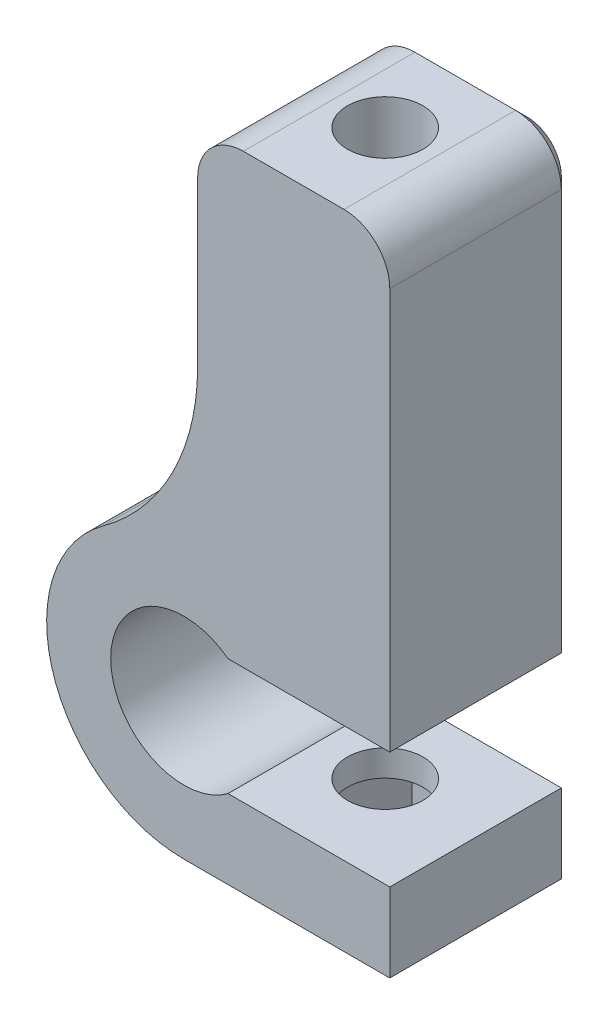
ISO-10303-21;
HEADER;
FILE_DESCRIPTION(('STEP AP214'),'2;1');
FILE_NAME('part.step','',(''),(''),'','','');
FILE_SCHEMA(('AUTOMOTIVE_DESIGN { 1 0 10303 214 1 1 1 1 }'));
ENDSEC;
DATA;
#1=APPLICATION_CONTEXT('core data for automotive mechanical design processes');
#2=APPLICATION_PROTOCOL_DEFINITION('international standard','automotive_design',2000,#1);
#3=PRODUCT_CONTEXT('',#1,'mechanical');
#4=PRODUCT('Part','Part','',(#3));
#5=PRODUCT_RELATED_PRODUCT_CATEGORY('part','',(#4));
#6=PRODUCT_DEFINITION_FORMATION('','',#4);
#7=PRODUCT_DEFINITION_CONTEXT('part definition',#1,'design');
#8=PRODUCT_DEFINITION('design','',#6,#7);
#9=PRODUCT_DEFINITION_SHAPE('','',#8);
#10=(LENGTH_UNIT() NAMED_UNIT(*) SI_UNIT(.MILLI.,.METRE.));
#11=(NAMED_UNIT(*) PLANE_ANGLE_UNIT() SI_UNIT($,.RADIAN.));
#12=(NAMED_UNIT(*) SI_UNIT($,.STERADIAN.) SOLID_ANGLE_UNIT());
#13=UNCERTAINTY_MEASURE_WITH_UNIT(LENGTH_MEASURE(1.E-05),#10,'distance_accuracy_value','');
#14=(GEOMETRIC_REPRESENTATION_CONTEXT(3) GLOBAL_UNCERTAINTY_ASSIGNED_CONTEXT((#13)) GLOBAL_UNIT_ASSIGNED_CONTEXT((#10,
#11,#12)) REPRESENTATION_CONTEXT('',''));
#15=CARTESIAN_POINT('',(0.,0.,0.));
#16=DIRECTION('',(0.,0.,1.));
#17=DIRECTION('',(1.,0.,0.));
#18=AXIS2_PLACEMENT_3D('',#15,#16,#17);
#19=CARTESIAN_POINT('',(4.8,6.,4.));
#20=DIRECTION('',(0.,-1.,0.));
#21=DIRECTION('',(0.,0.,-1.));
#22=AXIS2_PLACEMENT_3D('',#19,#20,#21);
#23=CYLINDRICAL_SURFACE('',#22,1.65);
#24=CARTESIAN_POINT('',(4.8,-2.55271057360235,4.));
#25=DIRECTION('',(0.,-1.,0.));
#26=DIRECTION('',(1.,0.,0.));
#27=AXIS2_PLACEMENT_3D('',#24,#25,#26);
#28=CIRCLE('',#27,1.65);
#29=CARTESIAN_POINT('',(6.45,-2.55271057360235,4.));
#30=VERTEX_POINT('',#29);
#31=EDGE_CURVE('E264',#30,#30,#28,.T.);
#32=ORIENTED_EDGE('',*,*,#31,.F.);
#33=EDGE_LOOP('',(#32));
#34=FACE_BOUND('',#33,.T.);
#35=CARTESIAN_POINT('',(4.8,-3.7,4.));
#36=DIRECTION('',(0.,-1.,0.));
#37=DIRECTION('',(0.,0.,-1.));
#38=AXIS2_PLACEMENT_3D('',#35,#36,#37);
#39=CIRCLE('',#38,1.65);
#40=CARTESIAN_POINT('',(4.8,-3.7,2.35));
#41=VERTEX_POINT('',#40);
#42=EDGE_CURVE('E252',#41,#41,#39,.F.);
#43=ORIENTED_EDGE('',*,*,#42,.F.);
#44=EDGE_LOOP('',(#43));
#45=FACE_BOUND('',#44,.T.);
#46=ADVANCED_FACE('F34',(#34,#45),#23,.F.);
#47=CARTESIAN_POINT('',(0.,0.,8.));
#48=DIRECTION('',(0.,0.,-1.));
#49=DIRECTION('',(-1.,0.,0.));
#50=AXIS2_PLACEMENT_3D('',#47,#48,#49);
#51=CYLINDRICAL_SURFACE('',#50,3.2);
#52=DIRECTION('',(0.,0.,-1.));
#53=VECTOR('',#52,1.);
#54=CARTESIAN_POINT('',(1.92968099110157,-2.55271057360235,8.));
#55=LINE('',#54,#53);
#56=CARTESIAN_POINT('',(1.92968099110157,-2.55271057360235,8.));
#57=VERTEX_POINT('',#56);
#58=CARTESIAN_POINT('',(1.92968099110157,-2.55271057360235,0.500000000000002));
#59=VERTEX_POINT('',#58);
#60=EDGE_CURVE('E280',#57,#59,#55,.T.);
#61=ORIENTED_EDGE('',*,*,#60,.T.);
#62=CARTESIAN_POINT('',(0.,0.,0.500000000000002));
#63=DIRECTION('',(0.,0.,1.));
#64=DIRECTION('',(1.,0.,0.));
#65=AXIS2_PLACEMENT_3D('',#62,#63,#64);
#66=CIRCLE('',#65,3.2);
#67=CARTESIAN_POINT('',(1.92968099110157,2.55271057360235,0.500000000000002));
#68=VERTEX_POINT('',#67);
#69=EDGE_CURVE('E11',#59,#68,#66,.F.);
#70=ORIENTED_EDGE('',*,*,#69,.T.);
#71=DIRECTION('',(0.,0.,-1.));
#72=VECTOR('',#71,1.);
#73=CARTESIAN_POINT('',(1.92968099110157,2.55271057360235,8.));
#74=LINE('',#73,#72);
#75=CARTESIAN_POINT('',(1.92968099110157,2.55271057360235,8.));
#76=VERTEX_POINT('',#75);
#77=EDGE_CURVE('E293',#76,#68,#74,.T.);
#78=ORIENTED_EDGE('',*,*,#77,.F.);
#79=CARTESIAN_POINT('',(0.,0.,8.));
#80=DIRECTION('',(0.,0.,-1.));
#81=DIRECTION('',(1.,0.,0.));
#82=AXIS2_PLACEMENT_3D('',#79,#80,#81);
#83=CIRCLE('',#82,3.2);
#84=EDGE_CURVE('E263',#57,#76,#83,.T.);
#85=ORIENTED_EDGE('',*,*,#84,.F.);
#86=EDGE_LOOP('',(#61,#70,#78,#85));
#87=FACE_BOUND('',#86,.T.);
#88=ADVANCED_FACE('F477',(#87),#51,.F.);
#89=CARTESIAN_POINT('',(9.,2.55271057360236,8.));
#90=DIRECTION('',(0.,1.,0.));
#91=DIRECTION('',(-1.,0.,0.));
#92=AXIS2_PLACEMENT_3D('',#89,#90,#91);
#93=PLANE('',#92);
#94=CARTESIAN_POINT('',(4.8,2.55271057360236,4.));
#95=DIRECTION('',(0.,1.,0.));
#96=DIRECTION('',(-1.,0.,0.));
#97=AXIS2_PLACEMENT_3D('',#94,#95,#96);
#98=CIRCLE('',#97,1.65);
#99=CARTESIAN_POINT('',(3.15,2.55271057360236,4.));
#100=VERTEX_POINT('',#99);
#101=EDGE_CURVE('E260',#100,#100,#98,.T.);
#102=ORIENTED_EDGE('',*,*,#101,.T.);
#103=EDGE_LOOP('',(#102));
#104=FACE_BOUND('',#103,.T.);
#105=ORIENTED_EDGE('',*,*,#77,.T.);
#106=DIRECTION('',(1.,0.,0.));
#107=VECTOR('',#106,1.);
#108=CARTESIAN_POINT('',(9.,2.55271057360236,0.500000000000002));
#109=LINE('',#108,#107);
#110=CARTESIAN_POINT('',(9.,2.55271057360236,0.500000000000002));
#111=VERTEX_POINT('',#110);
#112=EDGE_CURVE('E364',#68,#111,#109,.T.);
#113=ORIENTED_EDGE('',*,*,#112,.T.);
#114=DIRECTION('',(0.,0.,-1.));
#115=VECTOR('',#114,1.);
#116=CARTESIAN_POINT('',(9.,2.55271057360236,8.));
#117=LINE('',#116,#115);
#118=CARTESIAN_POINT('',(9.,2.55271057360236,8.));
#119=VERTEX_POINT('',#118);
#120=EDGE_CURVE('E290',#119,#111,#117,.T.);
#121=ORIENTED_EDGE('',*,*,#120,.F.);
#122=DIRECTION('',(1.,0.,0.));
#123=VECTOR('',#122,1.);
#124=CARTESIAN_POINT('',(9.,2.55271057360236,8.));
#125=LINE('',#124,#123);
#126=EDGE_CURVE('E267',#76,#119,#125,.T.);
#127=ORIENTED_EDGE('',*,*,#126,.F.);
#128=EDGE_LOOP('',(#105,#113,#121,#127));
#129=FACE_BOUND('',#128,.T.);
#130=ADVANCED_FACE('F480',(#104,#129),#93,.F.);
#131=CARTESIAN_POINT('',(9.,6.,8.));
#132=DIRECTION('',(-1.,0.,0.));
#133=DIRECTION('',(0.,0.,1.));
#134=AXIS2_PLACEMENT_3D('',#131,#132,#133);
#135=PLANE('',#134);
#136=ORIENTED_EDGE('',*,*,#120,.T.);
#137=DIRECTION('',(0.,1.,0.));
#138=VECTOR('',#137,1.);
#139=CARTESIAN_POINT('',(9.,6.,0.500000000000002));
#140=LINE('',#139,#138);
#141=CARTESIAN_POINT('',(9.,20.1,0.500000000000002));
#142=VERTEX_POINT('',#141);
#143=EDGE_CURVE('E320',#111,#142,#140,.T.);
#144=ORIENTED_EDGE('',*,*,#143,.T.);
#145=DIRECTION('',(0.,0.,-1.));
#146=VECTOR('',#145,1.);
#147=CARTESIAN_POINT('',(9.,20.1,8.));
#148=LINE('',#147,#146);
#149=CARTESIAN_POINT('',(9.,20.1,8.));
#150=VERTEX_POINT('',#149);
#151=EDGE_CURVE('E311',#142,#150,#148,.F.);
#152=ORIENTED_EDGE('',*,*,#151,.T.);
#153=DIRECTION('',(0.,1.,0.));
#154=VECTOR('',#153,1.);
#155=CARTESIAN_POINT('',(9.,6.,8.));
#156=LINE('',#155,#154);
#157=EDGE_CURVE('E269',#119,#150,#156,.T.);
#158=ORIENTED_EDGE('',*,*,#157,.F.);
#159=EDGE_LOOP('',(#136,#144,#152,#158));
#160=FACE_BOUND('',#159,.T.);
#161=ADVANCED_FACE('F495',(#160),#135,.F.);
#162=CARTESIAN_POINT('',(0.,0.,8.));
#163=DIRECTION('',(0.,0.,-1.));
#164=DIRECTION('',(-1.,0.,0.));
#165=AXIS2_PLACEMENT_3D('',#162,#163,#164);
#166=CYLINDRICAL_SURFACE('',#165,6.);
#167=DIRECTION('',(0.,0.,-1.));
#168=VECTOR('',#167,1.);
#169=CARTESIAN_POINT('',(-3.525,4.85534499289185,8.));
#170=LINE('',#169,#168);
#171=CARTESIAN_POINT('',(-3.525,4.85534499289185,8.));
#172=VERTEX_POINT('',#171);
#173=CARTESIAN_POINT('',(-3.525,4.85534499289185,0.500000000000002));
#174=VERTEX_POINT('',#173);
#175=EDGE_CURVE('E301',#172,#174,#170,.T.);
#176=ORIENTED_EDGE('',*,*,#175,.T.);
#177=CARTESIAN_POINT('',(0.,0.,0.500000000000002));
#178=DIRECTION('',(0.,0.,1.));
#179=DIRECTION('',(1.,0.,0.));
#180=AXIS2_PLACEMENT_3D('',#177,#178,#179);
#181=CIRCLE('',#180,6.);
#182=CARTESIAN_POINT('',(0.,-6.,0.500000000000002));
#183=VERTEX_POINT('',#182);
#184=EDGE_CURVE('E358',#174,#183,#181,.T.);
#185=ORIENTED_EDGE('',*,*,#184,.T.);
#186=DIRECTION('',(0.,0.,-1.));
#187=VECTOR('',#186,1.);
#188=CARTESIAN_POINT('',(0.,-6.,8.));
#189=LINE('',#188,#187);
#190=CARTESIAN_POINT('',(0.,-6.,8.));
#191=VERTEX_POINT('',#190);
#192=EDGE_CURVE('E287',#191,#183,#189,.T.);
#193=ORIENTED_EDGE('',*,*,#192,.F.);
#194=CARTESIAN_POINT('',(0.,0.,8.));
#195=DIRECTION('',(0.,0.,1.));
#196=DIRECTION('',(1.,0.,0.));
#197=AXIS2_PLACEMENT_3D('',#194,#195,#196);
#198=CIRCLE('',#197,6.);
#199=EDGE_CURVE('E272',#172,#191,#198,.T.);
#200=ORIENTED_EDGE('',*,*,#199,.F.);
#201=EDGE_LOOP('',(#176,#185,#193,#200));
#202=FACE_BOUND('',#201,.T.);
#203=ADVANCED_FACE('F458',(#202),#166,.T.);
#204=CARTESIAN_POINT('',(0.,-6.,8.));
#205=DIRECTION('',(0.,1.,0.));
#206=DIRECTION('',(0.,0.,1.));
#207=AXIS2_PLACEMENT_3D('',#204,#205,#206);
#208=PLANE('',#207);
#209=DIRECTION('',(-1.,0.,0.));
#210=VECTOR('',#209,1.);
#211=CARTESIAN_POINT('',(6.4,-6.,6.7712812921102));
#212=LINE('',#211,#210);
#213=CARTESIAN_POINT('',(6.4,-6.,6.7712812921102));
#214=VERTEX_POINT('',#213);
#215=CARTESIAN_POINT('',(3.2,-6.,6.7712812921102));
#216=VERTEX_POINT('',#215);
#217=EDGE_CURVE('E240',#214,#216,#212,.T.);
#218=ORIENTED_EDGE('',*,*,#217,.F.);
#219=DIRECTION('',(-0.5,0.,0.866025403784439));
#220=VECTOR('',#219,1.);
#221=CARTESIAN_POINT('',(8.,-6.,4.));
#222=LINE('',#221,#220);
#223=CARTESIAN_POINT('',(8.,-6.,4.));
#224=VERTEX_POINT('',#223);
#225=EDGE_CURVE('E204',#224,#214,#222,.T.);
#226=ORIENTED_EDGE('',*,*,#225,.F.);
#227=DIRECTION('',(0.5,0.,0.866025403784439));
#228=VECTOR('',#227,1.);
#229=CARTESIAN_POINT('',(6.4,-6.,1.2287187078898));
#230=LINE('',#229,#228);
#231=CARTESIAN_POINT('',(6.4,-6.,1.2287187078898));
#232=VERTEX_POINT('',#231);
#233=EDGE_CURVE('E223',#232,#224,#230,.T.);
#234=ORIENTED_EDGE('',*,*,#233,.F.);
#235=DIRECTION('',(1.,0.,0.));
#236=VECTOR('',#235,1.);
#237=CARTESIAN_POINT('',(3.2,-6.,1.2287187078898));
#238=LINE('',#237,#236);
#239=CARTESIAN_POINT('',(3.2,-6.,1.2287187078898));
#240=VERTEX_POINT('',#239);
#241=EDGE_CURVE('E226',#240,#232,#238,.T.);
#242=ORIENTED_EDGE('',*,*,#241,.F.);
#243=DIRECTION('',(0.5,0.,-0.866025403784438));
#244=VECTOR('',#243,1.);
#245=CARTESIAN_POINT('',(1.6,-6.,4.));
#246=LINE('',#245,#244);
#247=CARTESIAN_POINT('',(1.6,-6.,4.));
#248=VERTEX_POINT('',#247);
#249=EDGE_CURVE('E245',#248,#240,#246,.T.);
#250=ORIENTED_EDGE('',*,*,#249,.F.);
#251=DIRECTION('',(-0.5,0.,-0.866025403784439));
#252=VECTOR('',#251,1.);
#253=CARTESIAN_POINT('',(3.2,-6.,6.7712812921102));
#254=LINE('',#253,#252);
#255=EDGE_CURVE('E242',#216,#248,#254,.T.);
#256=ORIENTED_EDGE('',*,*,#255,.F.);
#257=EDGE_LOOP('',(#218,#226,#234,#242,#250,#256));
#258=FACE_BOUND('',#257,.T.);
#259=ORIENTED_EDGE('',*,*,#192,.T.);
#260=DIRECTION('',(1.,0.,0.));
#261=VECTOR('',#260,1.);
#262=CARTESIAN_POINT('',(0.,-6.,0.500000000000002));
#263=LINE('',#262,#261);
#264=CARTESIAN_POINT('',(9.,-6.,0.500000000000002));
#265=VERTEX_POINT('',#264);
#266=EDGE_CURVE('E360',#183,#265,#263,.T.);
#267=ORIENTED_EDGE('',*,*,#266,.T.);
#268=DIRECTION('',(0.,0.,-1.));
#269=VECTOR('',#268,1.);
#270=CARTESIAN_POINT('',(9.,-6.,8.));
#271=LINE('',#270,#269);
#272=CARTESIAN_POINT('',(9.,-6.,8.));
#273=VERTEX_POINT('',#272);
#274=EDGE_CURVE('E284',#273,#265,#271,.T.);
#275=ORIENTED_EDGE('',*,*,#274,.F.);
#276=DIRECTION('',(1.,0.,0.));
#277=VECTOR('',#276,1.);
#278=CARTESIAN_POINT('',(0.,-6.,8.));
#279=LINE('',#278,#277);
#280=EDGE_CURVE('E274',#191,#273,#279,.T.);
#281=ORIENTED_EDGE('',*,*,#280,.F.);
#282=EDGE_LOOP('',(#259,#267,#275,#281));
#283=FACE_BOUND('',#282,.T.);
#284=ADVANCED_FACE('F467',(#258,#283),#208,.F.);
#285=CARTESIAN_POINT('',(9.,-6.,8.));
#286=DIRECTION('',(-1.,0.,0.));
#287=DIRECTION('',(0.,0.,1.));
#288=AXIS2_PLACEMENT_3D('',#285,#286,#287);
#289=PLANE('',#288);
#290=ORIENTED_EDGE('',*,*,#274,.T.);
#291=DIRECTION('',(0.,1.,0.));
#292=VECTOR('',#291,1.);
#293=CARTESIAN_POINT('',(9.,-6.,0.500000000000002));
#294=LINE('',#293,#292);
#295=CARTESIAN_POINT('',(9.,-2.55271057360236,0.500000000000002));
#296=VERTEX_POINT('',#295);
#297=EDGE_CURVE('E362',#265,#296,#294,.T.);
#298=ORIENTED_EDGE('',*,*,#297,.T.);
#299=DIRECTION('',(0.,0.,-1.));
#300=VECTOR('',#299,1.);
#301=CARTESIAN_POINT('',(9.,-2.55271057360236,8.));
#302=LINE('',#301,#300);
#303=CARTESIAN_POINT('',(9.,-2.55271057360236,8.));
#304=VERTEX_POINT('',#303);
#305=EDGE_CURVE('E282',#304,#296,#302,.T.);
#306=ORIENTED_EDGE('',*,*,#305,.F.);
#307=DIRECTION('',(0.,1.,0.));
#308=VECTOR('',#307,1.);
#309=CARTESIAN_POINT('',(9.,-6.,8.));
#310=LINE('',#309,#308);
#311=EDGE_CURVE('E276',#273,#304,#310,.T.);
#312=ORIENTED_EDGE('',*,*,#311,.F.);
#313=EDGE_LOOP('',(#290,#298,#306,#312));
#314=FACE_BOUND('',#313,.T.);
#315=ADVANCED_FACE('F471',(#314),#289,.F.);
#316=CARTESIAN_POINT('',(9.,-2.55271057360236,8.));
#317=DIRECTION('',(0.,-1.,0.));
#318=DIRECTION('',(1.,0.,0.));
#319=AXIS2_PLACEMENT_3D('',#316,#317,#318);
#320=PLANE('',#319);
#321=ORIENTED_EDGE('',*,*,#31,.T.);
#322=EDGE_LOOP('',(#321));
#323=FACE_BOUND('',#322,.T.);
#324=ORIENTED_EDGE('',*,*,#305,.T.);
#325=DIRECTION('',(-1.,0.,0.));
#326=VECTOR('',#325,1.);
#327=CARTESIAN_POINT('',(9.,-2.55271057360236,0.500000000000002));
#328=LINE('',#327,#326);
#329=EDGE_CURVE('E43',#296,#59,#328,.T.);
#330=ORIENTED_EDGE('',*,*,#329,.T.);
#331=ORIENTED_EDGE('',*,*,#60,.F.);
#332=DIRECTION('',(-1.,0.,0.));
#333=VECTOR('',#332,1.);
#334=CARTESIAN_POINT('',(9.,-2.55271057360236,8.));
#335=LINE('',#334,#333);
#336=EDGE_CURVE('E278',#304,#57,#335,.T.);
#337=ORIENTED_EDGE('',*,*,#336,.F.);
#338=EDGE_LOOP('',(#324,#330,#331,#337));
#339=FACE_BOUND('',#338,.T.);
#340=ADVANCED_FACE('F475',(#323,#339),#320,.F.);
#341=CARTESIAN_POINT('',(0.,0.,8.));
#342=DIRECTION('',(0.,0.,1.));
#343=DIRECTION('',(1.,0.,0.));
#344=AXIS2_PLACEMENT_3D('',#341,#342,#343);
#345=PLANE('',#344);
#346=ORIENTED_EDGE('',*,*,#157,.T.);
#347=CARTESIAN_POINT('',(7.,20.1,8.));
#348=DIRECTION('',(0.,0.,1.));
#349=DIRECTION('',(1.,0.,0.));
#350=AXIS2_PLACEMENT_3D('',#347,#348,#349);
#351=CIRCLE('',#350,2.);
#352=CARTESIAN_POINT('',(7.,22.1,8.));
#353=VERTEX_POINT('',#352);
#354=EDGE_CURVE('E315',#150,#353,#351,.T.);
#355=ORIENTED_EDGE('',*,*,#354,.T.);
#356=DIRECTION('',(1.,0.,0.));
#357=VECTOR('',#356,1.);
#358=CARTESIAN_POINT('',(0.6,22.1,8.));
#359=LINE('',#358,#357);
#360=CARTESIAN_POINT('',(2.6,22.1,8.));
#361=VERTEX_POINT('',#360);
#362=EDGE_CURVE('E435',#361,#353,#359,.T.);
#363=ORIENTED_EDGE('',*,*,#362,.F.);
#364=CARTESIAN_POINT('',(2.6,20.1,8.));
#365=DIRECTION('',(0.,0.,1.));
#366=DIRECTION('',(1.,0.,0.));
#367=AXIS2_PLACEMENT_3D('',#364,#365,#366);
#368=CIRCLE('',#367,2.);
#369=CARTESIAN_POINT('',(0.6,20.1,8.));
#370=VERTEX_POINT('',#369);
#371=EDGE_CURVE('E313',#361,#370,#368,.T.);
#372=ORIENTED_EDGE('',*,*,#371,.T.);
#373=DIRECTION('',(0.,-1.,0.));
#374=VECTOR('',#373,1.);
#375=CARTESIAN_POINT('',(0.6,22.1,8.));
#376=LINE('',#375,#374);
#377=CARTESIAN_POINT('',(0.6,12.9475866477116,8.));
#378=VERTEX_POINT('',#377);
#379=EDGE_CURVE('E229',#370,#378,#376,.T.);
#380=ORIENTED_EDGE('',*,*,#379,.T.);
#381=CARTESIAN_POINT('',(-9.4,12.9475866477116,8.));
#382=DIRECTION('',(0.,0.,1.));
#383=DIRECTION('',(1.,0.,0.));
#384=AXIS2_PLACEMENT_3D('',#381,#382,#383);
#385=CIRCLE('',#384,10.);
#386=EDGE_CURVE('E304',#378,#172,#385,.F.);
#387=ORIENTED_EDGE('',*,*,#386,.T.);
#388=ORIENTED_EDGE('',*,*,#199,.T.);
#389=ORIENTED_EDGE('',*,*,#280,.T.);
#390=ORIENTED_EDGE('',*,*,#311,.T.);
#391=ORIENTED_EDGE('',*,*,#336,.T.);
#392=ORIENTED_EDGE('',*,*,#84,.T.);
#393=ORIENTED_EDGE('',*,*,#126,.T.);
#394=EDGE_LOOP('',(#346,#355,#363,#372,#380,#387,#388,#389,#390,#391,#392,#393));
#395=FACE_BOUND('',#394,.T.);
#396=ADVANCED_FACE('F447',(#395),#345,.T.);
#397=CARTESIAN_POINT('',(0.,0.,0.));
#398=DIRECTION('',(0.,0.,1.));
#399=DIRECTION('',(1.,0.,0.));
#400=AXIS2_PLACEMENT_3D('',#397,#398,#399);
#401=PLANE('',#400);
#402=CARTESIAN_POINT('',(7.,20.1,0.));
#403=DIRECTION('',(0.,0.,1.));
#404=DIRECTION('',(1.,0.,0.));
#405=AXIS2_PLACEMENT_3D('',#402,#403,#404);
#406=CIRCLE('',#405,1.49999999999999);
#407=CARTESIAN_POINT('',(7.,21.6,0.));
#408=VERTEX_POINT('',#407);
#409=CARTESIAN_POINT('',(8.49999999999999,20.1,0.));
#410=VERTEX_POINT('',#409);
#411=EDGE_CURVE('E343',#408,#410,#406,.F.);
#412=ORIENTED_EDGE('',*,*,#411,.T.);
#413=DIRECTION('',(0.,-1.,0.));
#414=VECTOR('',#413,1.);
#415=CARTESIAN_POINT('',(8.49999999999999,0.,0.));
#416=LINE('',#415,#414);
#417=CARTESIAN_POINT('',(8.49999999999999,3.05271057360236,0.));
#418=VERTEX_POINT('',#417);
#419=EDGE_CURVE('E345',#410,#418,#416,.T.);
#420=ORIENTED_EDGE('',*,*,#419,.T.);
#421=DIRECTION('',(-1.,0.,0.));
#422=VECTOR('',#421,1.);
#423=CARTESIAN_POINT('',(0.,3.05271057360236,0.));
#424=LINE('',#423,#422);
#425=CARTESIAN_POINT('',(2.09068365704054,3.05271057360236,0.));
#426=VERTEX_POINT('',#425);
#427=EDGE_CURVE('E327',#418,#426,#424,.T.);
#428=ORIENTED_EDGE('',*,*,#427,.T.);
#429=CARTESIAN_POINT('',(0.,0.,0.));
#430=DIRECTION('',(0.,0.,1.));
#431=DIRECTION('',(1.,0.,0.));
#432=AXIS2_PLACEMENT_3D('',#429,#430,#431);
#433=CIRCLE('',#432,3.70000000000001);
#434=CARTESIAN_POINT('',(2.09068365704054,-3.05271057360236,0.));
#435=VERTEX_POINT('',#434);
#436=EDGE_CURVE('E323',#426,#435,#433,.T.);
#437=ORIENTED_EDGE('',*,*,#436,.T.);
#438=DIRECTION('',(1.,0.,0.));
#439=VECTOR('',#438,1.);
#440=CARTESIAN_POINT('',(0.,-3.05271057360236,0.));
#441=LINE('',#440,#439);
#442=CARTESIAN_POINT('',(8.49999999999999,-3.05271057360236,0.));
#443=VERTEX_POINT('',#442);
#444=EDGE_CURVE('E325',#435,#443,#441,.T.);
#445=ORIENTED_EDGE('',*,*,#444,.T.);
#446=DIRECTION('',(0.,-1.,0.));
#447=VECTOR('',#446,1.);
#448=CARTESIAN_POINT('',(8.49999999999999,0.,0.));
#449=LINE('',#448,#447);
#450=CARTESIAN_POINT('',(8.49999999999999,-5.49999999999999,0.));
#451=VERTEX_POINT('',#450);
#452=EDGE_CURVE('E329',#443,#451,#449,.T.);
#453=ORIENTED_EDGE('',*,*,#452,.T.);
#454=DIRECTION('',(-1.,0.,0.));
#455=VECTOR('',#454,1.);
#456=CARTESIAN_POINT('',(0.,-5.49999999999999,0.));
#457=LINE('',#456,#455);
#458=CARTESIAN_POINT('',(0.,-5.49999999999999,0.));
#459=VERTEX_POINT('',#458);
#460=EDGE_CURVE('E331',#451,#459,#457,.T.);
#461=ORIENTED_EDGE('',*,*,#460,.T.);
#462=CARTESIAN_POINT('',(0.,0.,0.));
#463=DIRECTION('',(0.,0.,1.));
#464=DIRECTION('',(1.,0.,0.));
#465=AXIS2_PLACEMENT_3D('',#462,#463,#464);
#466=CIRCLE('',#465,5.49999999999999);
#467=CARTESIAN_POINT('',(-3.23125,4.45073291015086,0.));
#468=VERTEX_POINT('',#467);
#469=EDGE_CURVE('E333',#459,#468,#466,.F.);
#470=ORIENTED_EDGE('',*,*,#469,.T.);
#471=CARTESIAN_POINT('',(-9.4,12.9475866477116,0.));
#472=DIRECTION('',(0.,0.,1.));
#473=DIRECTION('',(1.,0.,0.));
#474=AXIS2_PLACEMENT_3D('',#471,#472,#473);
#475=CIRCLE('',#474,10.5);
#476=CARTESIAN_POINT('',(1.10000000000001,12.9475866477116,0.));
#477=VERTEX_POINT('',#476);
#478=EDGE_CURVE('E335',#468,#477,#475,.T.);
#479=ORIENTED_EDGE('',*,*,#478,.T.);
#480=DIRECTION('',(0.,1.,0.));
#481=VECTOR('',#480,1.);
#482=CARTESIAN_POINT('',(1.1,0.,0.));
#483=LINE('',#482,#481);
#484=CARTESIAN_POINT('',(1.1,20.1,0.));
#485=VERTEX_POINT('',#484);
#486=EDGE_CURVE('E337',#477,#485,#483,.T.);
#487=ORIENTED_EDGE('',*,*,#486,.T.);
#488=CARTESIAN_POINT('',(2.6,20.1,0.));
#489=DIRECTION('',(0.,0.,1.));
#490=DIRECTION('',(1.,0.,0.));
#491=AXIS2_PLACEMENT_3D('',#488,#489,#490);
#492=CIRCLE('',#491,1.49999999999999);
#493=CARTESIAN_POINT('',(2.6,21.6,0.));
#494=VERTEX_POINT('',#493);
#495=EDGE_CURVE('E339',#485,#494,#492,.F.);
#496=ORIENTED_EDGE('',*,*,#495,.T.);
#497=DIRECTION('',(1.,0.,0.));
#498=VECTOR('',#497,1.);
#499=CARTESIAN_POINT('',(0.,21.6,0.));
#500=LINE('',#499,#498);
#501=EDGE_CURVE('E341',#494,#408,#500,.T.);
#502=ORIENTED_EDGE('',*,*,#501,.T.);
#503=EDGE_LOOP('',(#412,#420,#428,#437,#445,#453,#461,#470,#479,#487,#496,#502));
#504=FACE_BOUND('',#503,.T.);
#505=ADVANCED_FACE('F511',(#504),#401,.F.);
#506=ORIENTED_EDGE('',*,*,#101,.F.);
#507=EDGE_LOOP('',(#506));
#508=FACE_BOUND('',#507,.T.);
#509=CARTESIAN_POINT('',(4.8,22.1,4.));
#510=DIRECTION('',(0.,1.,0.));
#511=DIRECTION('',(0.,0.,1.));
#512=AXIS2_PLACEMENT_3D('',#509,#510,#511);
#513=CIRCLE('',#512,1.65);
#514=CARTESIAN_POINT('',(4.8,22.1,5.65));
#515=VERTEX_POINT('',#514);
#516=EDGE_CURVE('E429',#515,#515,#513,.T.);
#517=ORIENTED_EDGE('',*,*,#516,.T.);
#518=EDGE_LOOP('',(#517));
#519=FACE_BOUND('',#518,.T.);
#520=ADVANCED_FACE('F539',(#508,#519),#23,.F.);
#521=CARTESIAN_POINT('',(0.,-3.7,0.));
#522=DIRECTION('',(0.,-1.,0.));
#523=DIRECTION('',(0.,0.,-1.));
#524=AXIS2_PLACEMENT_3D('',#521,#522,#523);
#525=PLANE('',#524);
#526=DIRECTION('',(-0.5,0.,0.866025403784439));
#527=VECTOR('',#526,1.);
#528=CARTESIAN_POINT('',(8.,-3.7,4.));
#529=LINE('',#528,#527);
#530=CARTESIAN_POINT('',(8.,-3.7,4.));
#531=VERTEX_POINT('',#530);
#532=CARTESIAN_POINT('',(6.4,-3.7,6.7712812921102));
#533=VERTEX_POINT('',#532);
#534=EDGE_CURVE('E201',#531,#533,#529,.T.);
#535=ORIENTED_EDGE('',*,*,#534,.T.);
#536=DIRECTION('',(-1.,0.,0.));
#537=VECTOR('',#536,1.);
#538=CARTESIAN_POINT('',(6.4,-3.7,6.7712812921102));
#539=LINE('',#538,#537);
#540=CARTESIAN_POINT('',(3.2,-3.7,6.7712812921102));
#541=VERTEX_POINT('',#540);
#542=EDGE_CURVE('E212',#533,#541,#539,.T.);
#543=ORIENTED_EDGE('',*,*,#542,.T.);
#544=DIRECTION('',(-0.5,0.,-0.866025403784439));
#545=VECTOR('',#544,1.);
#546=CARTESIAN_POINT('',(3.2,-3.7,6.7712812921102));
#547=LINE('',#546,#545);
#548=CARTESIAN_POINT('',(1.6,-3.7,4.));
#549=VERTEX_POINT('',#548);
#550=EDGE_CURVE('E217',#541,#549,#547,.T.);
#551=ORIENTED_EDGE('',*,*,#550,.T.);
#552=DIRECTION('',(0.5,0.,-0.866025403784438));
#553=VECTOR('',#552,1.);
#554=CARTESIAN_POINT('',(1.6,-3.7,4.));
#555=LINE('',#554,#553);
#556=CARTESIAN_POINT('',(3.2,-3.7,1.2287187078898));
#557=VERTEX_POINT('',#556);
#558=EDGE_CURVE('E233',#549,#557,#555,.T.);
#559=ORIENTED_EDGE('',*,*,#558,.T.);
#560=DIRECTION('',(1.,0.,0.));
#561=VECTOR('',#560,1.);
#562=CARTESIAN_POINT('',(3.2,-3.7,1.2287187078898));
#563=LINE('',#562,#561);
#564=CARTESIAN_POINT('',(6.4,-3.7,1.2287187078898));
#565=VERTEX_POINT('',#564);
#566=EDGE_CURVE('E236',#557,#565,#563,.T.);
#567=ORIENTED_EDGE('',*,*,#566,.T.);
#568=DIRECTION('',(0.5,0.,0.866025403784439));
#569=VECTOR('',#568,1.);
#570=CARTESIAN_POINT('',(6.4,-3.7,1.2287187078898));
#571=LINE('',#570,#569);
#572=EDGE_CURVE('E209',#565,#531,#571,.T.);
#573=ORIENTED_EDGE('',*,*,#572,.T.);
#574=EDGE_LOOP('',(#535,#543,#551,#559,#567,#573));
#575=FACE_BOUND('',#574,.T.);
#576=ORIENTED_EDGE('',*,*,#42,.T.);
#577=EDGE_LOOP('',(#576));
#578=FACE_BOUND('',#577,.T.);
#579=ADVANCED_FACE('F219',(#575,#578),#525,.T.);
#580=CARTESIAN_POINT('',(8.,-3.7,4.));
#581=DIRECTION('',(0.866025403784439,0.,0.5));
#582=DIRECTION('',(0.5,0.,-0.866025403784439));
#583=AXIS2_PLACEMENT_3D('',#580,#581,#582);
#584=PLANE('',#583);
#585=ORIENTED_EDGE('',*,*,#225,.T.);
#586=DIRECTION('',(0.,-1.,0.));
#587=VECTOR('',#586,1.);
#588=CARTESIAN_POINT('',(6.4,-3.7,6.7712812921102));
#589=LINE('',#588,#587);
#590=EDGE_CURVE('E197',#533,#214,#589,.T.);
#591=ORIENTED_EDGE('',*,*,#590,.F.);
#592=ORIENTED_EDGE('',*,*,#534,.F.);
#593=DIRECTION('',(0.,-1.,0.));
#594=VECTOR('',#593,1.);
#595=CARTESIAN_POINT('',(8.,-3.7,4.));
#596=LINE('',#595,#594);
#597=EDGE_CURVE('E250',#531,#224,#596,.T.);
#598=ORIENTED_EDGE('',*,*,#597,.T.);
#599=EDGE_LOOP('',(#585,#591,#592,#598));
#600=FACE_BOUND('',#599,.T.);
#601=ADVANCED_FACE('F199',(#600),#584,.F.);
#602=CARTESIAN_POINT('',(6.4,-3.7,1.2287187078898));
#603=DIRECTION('',(0.866025403784439,0.,-0.5));
#604=DIRECTION('',(-0.5,0.,-0.866025403784439));
#605=AXIS2_PLACEMENT_3D('',#602,#603,#604);
#606=PLANE('',#605);
#607=ORIENTED_EDGE('',*,*,#233,.T.);
#608=ORIENTED_EDGE('',*,*,#597,.F.);
#609=ORIENTED_EDGE('',*,*,#572,.F.);
#610=DIRECTION('',(0.,-1.,0.));
#611=VECTOR('',#610,1.);
#612=CARTESIAN_POINT('',(6.4,-3.7,1.2287187078898));
#613=LINE('',#612,#611);
#614=EDGE_CURVE('E253',#565,#232,#613,.T.);
#615=ORIENTED_EDGE('',*,*,#614,.T.);
#616=EDGE_LOOP('',(#607,#608,#609,#615));
#617=FACE_BOUND('',#616,.T.);
#618=ADVANCED_FACE('F740',(#617),#606,.F.);
#619=CARTESIAN_POINT('',(3.2,-3.7,1.2287187078898));
#620=DIRECTION('',(0.,0.,-1.));
#621=DIRECTION('',(-1.,0.,0.));
#622=AXIS2_PLACEMENT_3D('',#619,#620,#621);
#623=PLANE('',#622);
#624=ORIENTED_EDGE('',*,*,#241,.T.);
#625=ORIENTED_EDGE('',*,*,#614,.F.);
#626=ORIENTED_EDGE('',*,*,#566,.F.);
#627=DIRECTION('',(0.,-1.,0.));
#628=VECTOR('',#627,1.);
#629=CARTESIAN_POINT('',(3.2,-3.7,1.2287187078898));
#630=LINE('',#629,#628);
#631=EDGE_CURVE('E255',#557,#240,#630,.T.);
#632=ORIENTED_EDGE('',*,*,#631,.T.);
#633=EDGE_LOOP('',(#624,#625,#626,#632));
#634=FACE_BOUND('',#633,.T.);
#635=ADVANCED_FACE('F731',(#634),#623,.F.);
#636=CARTESIAN_POINT('',(1.6,-3.7,4.));
#637=DIRECTION('',(-0.866025403784438,0.,-0.5));
#638=DIRECTION('',(-0.5,0.,0.866025403784438));
#639=AXIS2_PLACEMENT_3D('',#636,#637,#638);
#640=PLANE('',#639);
#641=ORIENTED_EDGE('',*,*,#249,.T.);
#642=ORIENTED_EDGE('',*,*,#631,.F.);
#643=ORIENTED_EDGE('',*,*,#558,.F.);
#644=DIRECTION('',(0.,-1.,0.));
#645=VECTOR('',#644,1.);
#646=CARTESIAN_POINT('',(1.6,-3.7,4.));
#647=LINE('',#646,#645);
#648=EDGE_CURVE('E257',#549,#248,#647,.T.);
#649=ORIENTED_EDGE('',*,*,#648,.T.);
#650=EDGE_LOOP('',(#641,#642,#643,#649));
#651=FACE_BOUND('',#650,.T.);
#652=ADVANCED_FACE('F722',(#651),#640,.F.);
#653=CARTESIAN_POINT('',(3.2,-3.7,6.7712812921102));
#654=DIRECTION('',(-0.866025403784439,0.,0.5));
#655=DIRECTION('',(0.5,0.,0.866025403784439));
#656=AXIS2_PLACEMENT_3D('',#653,#654,#655);
#657=PLANE('',#656);
#658=ORIENTED_EDGE('',*,*,#255,.T.);
#659=ORIENTED_EDGE('',*,*,#648,.F.);
#660=ORIENTED_EDGE('',*,*,#550,.F.);
#661=DIRECTION('',(0.,-1.,0.));
#662=VECTOR('',#661,1.);
#663=CARTESIAN_POINT('',(3.2,-3.7,6.7712812921102));
#664=LINE('',#663,#662);
#665=EDGE_CURVE('E208',#541,#216,#664,.T.);
#666=ORIENTED_EDGE('',*,*,#665,.T.);
#667=EDGE_LOOP('',(#658,#659,#660,#666));
#668=FACE_BOUND('',#667,.T.);
#669=ADVANCED_FACE('F714',(#668),#657,.F.);
#670=CARTESIAN_POINT('',(6.4,-3.7,6.7712812921102));
#671=DIRECTION('',(0.,0.,1.));
#672=DIRECTION('',(1.,0.,0.));
#673=AXIS2_PLACEMENT_3D('',#670,#671,#672);
#674=PLANE('',#673);
#675=ORIENTED_EDGE('',*,*,#217,.T.);
#676=ORIENTED_EDGE('',*,*,#665,.F.);
#677=ORIENTED_EDGE('',*,*,#542,.F.);
#678=ORIENTED_EDGE('',*,*,#590,.T.);
#679=EDGE_LOOP('',(#675,#676,#677,#678));
#680=FACE_BOUND('',#679,.T.);
#681=ADVANCED_FACE('F213',(#680),#674,.F.);
#682=CARTESIAN_POINT('',(0.,22.1,0.));
#683=DIRECTION('',(0.,-1.,0.));
#684=DIRECTION('',(0.,0.,-1.));
#685=AXIS2_PLACEMENT_3D('',#682,#683,#684);
#686=PLANE('',#685);
#687=DIRECTION('',(0.,0.,-1.));
#688=VECTOR('',#687,1.);
#689=CARTESIAN_POINT('',(7.,22.1,0.));
#690=LINE('',#689,#688);
#691=CARTESIAN_POINT('',(7.,22.1,0.500000000000002));
#692=VERTEX_POINT('',#691);
#693=EDGE_CURVE('E308',#353,#692,#690,.T.);
#694=ORIENTED_EDGE('',*,*,#693,.T.);
#695=DIRECTION('',(-1.,0.,0.));
#696=VECTOR('',#695,1.);
#697=CARTESIAN_POINT('',(0.,22.1,0.500000000000002));
#698=LINE('',#697,#696);
#699=CARTESIAN_POINT('',(2.6,22.1,0.500000000000002));
#700=VERTEX_POINT('',#699);
#701=EDGE_CURVE('E350',#692,#700,#698,.T.);
#702=ORIENTED_EDGE('',*,*,#701,.T.);
#703=DIRECTION('',(0.,0.,1.));
#704=VECTOR('',#703,1.);
#705=CARTESIAN_POINT('',(2.6,22.1,0.));
#706=LINE('',#705,#704);
#707=EDGE_CURVE('E306',#700,#361,#706,.T.);
#708=ORIENTED_EDGE('',*,*,#707,.T.);
#709=ORIENTED_EDGE('',*,*,#362,.T.);
#710=EDGE_LOOP('',(#694,#702,#708,#709));
#711=FACE_BOUND('',#710,.T.);
#712=ORIENTED_EDGE('',*,*,#516,.F.);
#713=EDGE_LOOP('',(#712));
#714=FACE_BOUND('',#713,.T.);
#715=ADVANCED_FACE('F501',(#711,#714),#686,.F.);
#716=CARTESIAN_POINT('',(0.6,22.1,8.));
#717=DIRECTION('',(1.,0.,0.));
#718=DIRECTION('',(0.,0.,-1.));
#719=AXIS2_PLACEMENT_3D('',#716,#717,#718);
#720=PLANE('',#719);
#721=DIRECTION('',(0.,0.,1.));
#722=VECTOR('',#721,1.);
#723=CARTESIAN_POINT('',(0.6,20.1,8.));
#724=LINE('',#723,#722);
#725=CARTESIAN_POINT('',(0.6,20.1,0.500000000000002));
#726=VERTEX_POINT('',#725);
#727=EDGE_CURVE('E317',#370,#726,#724,.F.);
#728=ORIENTED_EDGE('',*,*,#727,.T.);
#729=DIRECTION('',(0.,-1.,0.));
#730=VECTOR('',#729,1.);
#731=CARTESIAN_POINT('',(0.6,22.1,0.500000000000002));
#732=LINE('',#731,#730);
#733=CARTESIAN_POINT('',(0.6,12.9475866477116,0.500000000000002));
#734=VERTEX_POINT('',#733);
#735=EDGE_CURVE('E354',#726,#734,#732,.T.);
#736=ORIENTED_EDGE('',*,*,#735,.T.);
#737=DIRECTION('',(0.,0.,1.));
#738=VECTOR('',#737,1.);
#739=CARTESIAN_POINT('',(0.6,12.9475866477116,8.));
#740=LINE('',#739,#738);
#741=EDGE_CURVE('E295',#734,#378,#740,.T.);
#742=ORIENTED_EDGE('',*,*,#741,.T.);
#743=ORIENTED_EDGE('',*,*,#379,.F.);
#744=EDGE_LOOP('',(#728,#736,#742,#743));
#745=FACE_BOUND('',#744,.T.);
#746=ADVANCED_FACE('F520',(#745),#720,.F.);
#747=CARTESIAN_POINT('',(-9.4,12.9475866477116,8.));
#748=DIRECTION('',(0.,0.,-1.));
#749=DIRECTION('',(-1.,0.,0.));
#750=AXIS2_PLACEMENT_3D('',#747,#748,#749);
#751=CYLINDRICAL_SURFACE('',#750,10.);
#752=ORIENTED_EDGE('',*,*,#741,.F.);
#753=CARTESIAN_POINT('',(-9.4,12.9475866477116,0.500000000000002));
#754=DIRECTION('',(0.,0.,1.));
#755=DIRECTION('',(1.,0.,0.));
#756=AXIS2_PLACEMENT_3D('',#753,#754,#755);
#757=CIRCLE('',#756,10.);
#758=EDGE_CURVE('E356',#734,#174,#757,.F.);
#759=ORIENTED_EDGE('',*,*,#758,.T.);
#760=ORIENTED_EDGE('',*,*,#175,.F.);
#761=ORIENTED_EDGE('',*,*,#386,.F.);
#762=EDGE_LOOP('',(#752,#759,#760,#761));
#763=FACE_BOUND('',#762,.T.);
#764=ADVANCED_FACE('F455',(#763),#751,.F.);
#765=CARTESIAN_POINT('',(7.,20.1,0.));
#766=DIRECTION('',(0.,0.,-1.));
#767=DIRECTION('',(-1.,0.,0.));
#768=AXIS2_PLACEMENT_3D('',#765,#766,#767);
#769=CYLINDRICAL_SURFACE('',#768,2.);
#770=ORIENTED_EDGE('',*,*,#151,.F.);
#771=CARTESIAN_POINT('',(7.,20.1,0.500000000000002));
#772=DIRECTION('',(0.,0.,1.));
#773=DIRECTION('',(1.,0.,0.));
#774=AXIS2_PLACEMENT_3D('',#771,#772,#773);
#775=CIRCLE('',#774,2.);
#776=EDGE_CURVE('E348',#142,#692,#775,.T.);
#777=ORIENTED_EDGE('',*,*,#776,.T.);
#778=ORIENTED_EDGE('',*,*,#693,.F.);
#779=ORIENTED_EDGE('',*,*,#354,.F.);
#780=EDGE_LOOP('',(#770,#777,#778,#779));
#781=FACE_BOUND('',#780,.T.);
#782=ADVANCED_FACE('F499',(#781),#769,.T.);
#783=CARTESIAN_POINT('',(2.6,20.1,0.));
#784=DIRECTION('',(0.,0.,1.));
#785=DIRECTION('',(1.,0.,0.));
#786=AXIS2_PLACEMENT_3D('',#783,#784,#785);
#787=CYLINDRICAL_SURFACE('',#786,2.);
#788=ORIENTED_EDGE('',*,*,#707,.F.);
#789=CARTESIAN_POINT('',(2.6,20.1,0.500000000000002));
#790=DIRECTION('',(0.,0.,1.));
#791=DIRECTION('',(1.,0.,0.));
#792=AXIS2_PLACEMENT_3D('',#789,#790,#791);
#793=CIRCLE('',#792,2.);
#794=EDGE_CURVE('E352',#700,#726,#793,.T.);
#795=ORIENTED_EDGE('',*,*,#794,.T.);
#796=ORIENTED_EDGE('',*,*,#727,.F.);
#797=ORIENTED_EDGE('',*,*,#371,.F.);
#798=EDGE_LOOP('',(#788,#795,#796,#797));
#799=FACE_BOUND('',#798,.T.);
#800=ADVANCED_FACE('F518',(#799),#787,.T.);
#801=CARTESIAN_POINT('',(0.,0.,0.500000000000002));
#802=DIRECTION('',(0.,0.,1.));
#803=DIRECTION('',(1.,0.,0.));
#804=AXIS2_PLACEMENT_3D('',#801,#802,#803);
#805=CONICAL_SURFACE('',#804,6.,0.785398163397452);
#806=DIRECTION('',(-0.415425233947098,0.572207894912332,0.707106781186545));
#807=VECTOR('',#806,1.);
#808=CARTESIAN_POINT('',(-3.23125,4.45073291015086,0.));
#809=LINE('',#808,#807);
#810=EDGE_CURVE('E422',#468,#174,#809,.T.);
#811=ORIENTED_EDGE('',*,*,#810,.F.);
#812=ORIENTED_EDGE('',*,*,#469,.F.);
#813=DIRECTION('',(0.,0.70710678118655,-0.707106781186545));
#814=VECTOR('',#813,1.);
#815=CARTESIAN_POINT('',(0.,-6.,0.500000000000002));
#816=LINE('',#815,#814);
#817=EDGE_CURVE('E38',#183,#459,#816,.T.);
#818=ORIENTED_EDGE('',*,*,#817,.F.);
#819=ORIENTED_EDGE('',*,*,#184,.F.);
#820=EDGE_LOOP('',(#811,#812,#818,#819));
#821=FACE_BOUND('',#820,.T.);
#822=ADVANCED_FACE('F36',(#821),#805,.T.);
#823=CARTESIAN_POINT('',(0.,-6.,0.500000000000002));
#824=DIRECTION('',(0.,0.707106781186545,0.70710678118655));
#825=DIRECTION('',(1.,0.,0.));
#826=AXIS2_PLACEMENT_3D('',#823,#824,#825);
#827=PLANE('',#826);
#828=ORIENTED_EDGE('',*,*,#817,.T.);
#829=ORIENTED_EDGE('',*,*,#460,.F.);
#830=DIRECTION('',(-0.577350269189627,0.577350269189627,-0.577350269189623));
#831=VECTOR('',#830,1.);
#832=CARTESIAN_POINT('',(9.,-6.,0.500000000000002));
#833=LINE('',#832,#831);
#834=EDGE_CURVE('E420',#265,#451,#833,.T.);
#835=ORIENTED_EDGE('',*,*,#834,.F.);
#836=ORIENTED_EDGE('',*,*,#266,.F.);
#837=EDGE_LOOP('',(#828,#829,#835,#836));
#838=FACE_BOUND('',#837,.T.);
#839=ADVANCED_FACE('F463',(#838),#827,.F.);
#840=CARTESIAN_POINT('',(-9.4,12.9475866477116,0.));
#841=DIRECTION('',(0.,0.,-1.));
#842=DIRECTION('',(-1.,0.,0.));
#843=AXIS2_PLACEMENT_3D('',#840,#841,#842);
#844=CONICAL_SURFACE('',#843,10.5,0.785398163397453);
#845=ORIENTED_EDGE('',*,*,#810,.T.);
#846=ORIENTED_EDGE('',*,*,#758,.F.);
#847=DIRECTION('',(-0.707106781186551,0.,0.707106781186544));
#848=VECTOR('',#847,1.);
#849=CARTESIAN_POINT('',(1.10000000000001,12.9475866477116,0.));
#850=LINE('',#849,#848);
#851=EDGE_CURVE('E417',#477,#734,#850,.T.);
#852=ORIENTED_EDGE('',*,*,#851,.F.);
#853=ORIENTED_EDGE('',*,*,#478,.F.);
#854=EDGE_LOOP('',(#845,#846,#852,#853));
#855=FACE_BOUND('',#854,.T.);
#856=ADVANCED_FACE('F523',(#855),#844,.F.);
#857=CARTESIAN_POINT('',(9.,-6.,0.500000000000002));
#858=DIRECTION('',(-0.707106781186545,0.,0.70710678118655));
#859=DIRECTION('',(0.,1.,0.));
#860=AXIS2_PLACEMENT_3D('',#857,#858,#859);
#861=PLANE('',#860);
#862=ORIENTED_EDGE('',*,*,#834,.T.);
#863=ORIENTED_EDGE('',*,*,#452,.F.);
#864=DIRECTION('',(-0.577350269189627,-0.577350269189627,-0.577350269189623));
#865=VECTOR('',#864,1.);
#866=CARTESIAN_POINT('',(9.,-2.55271057360236,0.500000000000002));
#867=LINE('',#866,#865);
#868=EDGE_CURVE('E414',#296,#443,#867,.T.);
#869=ORIENTED_EDGE('',*,*,#868,.F.);
#870=ORIENTED_EDGE('',*,*,#297,.F.);
#871=EDGE_LOOP('',(#862,#863,#869,#870));
#872=FACE_BOUND('',#871,.T.);
#873=ADVANCED_FACE('F526',(#872),#861,.F.);
#874=CARTESIAN_POINT('',(0.6,22.1,0.500000000000002));
#875=DIRECTION('',(0.707106781186545,0.,0.70710678118655));
#876=DIRECTION('',(0.,-1.,0.));
#877=AXIS2_PLACEMENT_3D('',#874,#875,#876);
#878=PLANE('',#877);
#879=ORIENTED_EDGE('',*,*,#851,.T.);
#880=ORIENTED_EDGE('',*,*,#735,.F.);
#881=DIRECTION('',(-0.70710678118655,0.,0.707106781186545));
#882=VECTOR('',#881,1.);
#883=CARTESIAN_POINT('',(1.1,20.1,0.));
#884=LINE('',#883,#882);
#885=EDGE_CURVE('E411',#485,#726,#884,.T.);
#886=ORIENTED_EDGE('',*,*,#885,.F.);
#887=ORIENTED_EDGE('',*,*,#486,.F.);
#888=EDGE_LOOP('',(#879,#880,#886,#887));
#889=FACE_BOUND('',#888,.T.);
#890=ADVANCED_FACE('F402',(#889),#878,.F.);
#891=CARTESIAN_POINT('',(9.,-2.55271057360236,0.500000000000002));
#892=DIRECTION('',(0.,-0.707106781186545,0.707106781186549));
#893=DIRECTION('',(-1.,0.,0.));
#894=AXIS2_PLACEMENT_3D('',#891,#892,#893);
#895=PLANE('',#894);
#896=ORIENTED_EDGE('',*,*,#868,.T.);
#897=ORIENTED_EDGE('',*,*,#444,.F.);
#898=CARTESIAN_POINT('',(1.92968099110157,-2.55271057360235,0.500000000000002));
#899=CARTESIAN_POINT('',(1.95753607745007,-2.635879592847,0.416830980755354));
#900=CARTESIAN_POINT('',(1.98488052702274,-2.71913082597165,0.333579747630712));
#901=CARTESIAN_POINT('',(2.03854807955508,-2.88579749308601,0.166913080516352));
#902=CARTESIAN_POINT('',(2.06487118529539,-2.96921292662803,0.0834976469743265));
#903=CARTESIAN_POINT('',(2.09068365704054,-3.05271057360236,0.));
#904=B_SPLINE_CURVE_WITH_KNOTS('',3,(#898,#899,#900,#901,#902,#903),.UNSPECIFIED.,.F.,.F.,(4,2,
4),(0.,0.362606247883041,0.725211508485275),.UNSPECIFIED.);
#905=EDGE_CURVE('E405',#59,#435,#904,.T.);
#906=ORIENTED_EDGE('',*,*,#905,.F.);
#907=ORIENTED_EDGE('',*,*,#329,.F.);
#908=EDGE_LOOP('',(#896,#897,#906,#907));
#909=FACE_BOUND('',#908,.T.);
#910=ADVANCED_FACE('F397',(#909),#895,.F.);
#911=CARTESIAN_POINT('',(2.6,20.1,0.));
#912=DIRECTION('',(0.,0.,1.));
#913=DIRECTION('',(1.,0.,0.));
#914=AXIS2_PLACEMENT_3D('',#911,#912,#913);
#915=CONICAL_SURFACE('',#914,1.49999999999999,0.785398163397452);
#916=ORIENTED_EDGE('',*,*,#885,.T.);
#917=ORIENTED_EDGE('',*,*,#794,.F.);
#918=DIRECTION('',(0.,0.707106781186551,0.707106781186544));
#919=VECTOR('',#918,1.);
#920=CARTESIAN_POINT('',(2.6,21.6,0.));
#921=LINE('',#920,#919);
#922=EDGE_CURVE('E382',#494,#700,#921,.T.);
#923=ORIENTED_EDGE('',*,*,#922,.F.);
#924=ORIENTED_EDGE('',*,*,#495,.F.);
#925=EDGE_LOOP('',(#916,#917,#923,#924));
#926=FACE_BOUND('',#925,.T.);
#927=ADVANCED_FACE('F401',(#926),#915,.T.);
#928=CARTESIAN_POINT('',(0.,0.,0.500000000000002));
#929=DIRECTION('',(0.,0.,-1.));
#930=DIRECTION('',(-1.,0.,0.));
#931=AXIS2_PLACEMENT_3D('',#928,#929,#930);
#932=CONICAL_SURFACE('',#931,3.2,0.785398163397451);
#933=ORIENTED_EDGE('',*,*,#905,.T.);
#934=ORIENTED_EDGE('',*,*,#436,.F.);
#935=CARTESIAN_POINT('',(2.09068365704054,3.05271057360236,0.));
#936=CARTESIAN_POINT('',(2.06487118529539,2.96921292662803,0.0834976469743264));
#937=CARTESIAN_POINT('',(2.03854807955508,2.88579749308601,0.166913080516352));
#938=CARTESIAN_POINT('',(1.98488052702274,2.71913082597165,0.333579747630712));
#939=CARTESIAN_POINT('',(1.95753607745007,2.635879592847,0.416830980755354));
#940=CARTESIAN_POINT('',(1.92968099110157,2.55271057360235,0.500000000000002));
#941=B_SPLINE_CURVE_WITH_KNOTS('',3,(#935,#936,#937,#938,#939,#940),.UNSPECIFIED.,.F.,.F.,(4,2,
4),(0.,0.362605260602235,0.725211508485275),.UNSPECIFIED.);
#942=EDGE_CURVE('E374',#68,#426,#941,.F.);
#943=ORIENTED_EDGE('',*,*,#942,.F.);
#944=ORIENTED_EDGE('',*,*,#69,.F.);
#945=EDGE_LOOP('',(#933,#934,#943,#944));
#946=FACE_BOUND('',#945,.T.);
#947=ADVANCED_FACE('F384',(#946),#932,.F.);
#948=CARTESIAN_POINT('',(0.,22.1,0.500000000000002));
#949=DIRECTION('',(0.,-0.707106781186546,0.707106781186549));
#950=DIRECTION('',(-1.,0.,0.));
#951=AXIS2_PLACEMENT_3D('',#948,#949,#950);
#952=PLANE('',#951);
#953=ORIENTED_EDGE('',*,*,#922,.T.);
#954=ORIENTED_EDGE('',*,*,#701,.F.);
#955=DIRECTION('',(0.,0.707106781186549,0.707106781186546));
#956=VECTOR('',#955,1.);
#957=CARTESIAN_POINT('',(7.,21.6,0.));
#958=LINE('',#957,#956);
#959=EDGE_CURVE('E371',#408,#692,#958,.T.);
#960=ORIENTED_EDGE('',*,*,#959,.F.);
#961=ORIENTED_EDGE('',*,*,#501,.F.);
#962=EDGE_LOOP('',(#953,#954,#960,#961));
#963=FACE_BOUND('',#962,.T.);
#964=ADVANCED_FACE('F392',(#963),#952,.F.);
#965=CARTESIAN_POINT('',(9.,2.55271057360236,0.500000000000002));
#966=DIRECTION('',(0.,0.707106781186545,0.707106781186549));
#967=DIRECTION('',(1.,0.,0.));
#968=AXIS2_PLACEMENT_3D('',#965,#966,#967);
#969=PLANE('',#968);
#970=ORIENTED_EDGE('',*,*,#942,.T.);
#971=ORIENTED_EDGE('',*,*,#427,.F.);
#972=DIRECTION('',(0.577350269189627,-0.577350269189627,0.577350269189623));
#973=VECTOR('',#972,1.);
#974=CARTESIAN_POINT('',(9.,2.55271057360236,0.500000000000002));
#975=LINE('',#974,#973);
#976=EDGE_CURVE('E369',#111,#418,#975,.F.);
#977=ORIENTED_EDGE('',*,*,#976,.F.);
#978=ORIENTED_EDGE('',*,*,#112,.F.);
#979=EDGE_LOOP('',(#970,#971,#977,#978));
#980=FACE_BOUND('',#979,.T.);
#981=ADVANCED_FACE('F387',(#980),#969,.F.);
#982=CARTESIAN_POINT('',(7.,20.1,0.));
#983=DIRECTION('',(0.,0.,1.));
#984=DIRECTION('',(1.,0.,0.));
#985=AXIS2_PLACEMENT_3D('',#982,#983,#984);
#986=CONICAL_SURFACE('',#985,1.49999999999999,0.785398163397452);
#987=ORIENTED_EDGE('',*,*,#959,.T.);
#988=ORIENTED_EDGE('',*,*,#776,.F.);
#989=DIRECTION('',(0.70710678118655,0.,0.707106781186545));
#990=VECTOR('',#989,1.);
#991=CARTESIAN_POINT('',(8.49999999999999,20.1,0.));
#992=LINE('',#991,#990);
#993=EDGE_CURVE('E367',#410,#142,#992,.T.);
#994=ORIENTED_EDGE('',*,*,#993,.F.);
#995=ORIENTED_EDGE('',*,*,#411,.F.);
#996=EDGE_LOOP('',(#987,#988,#994,#995));
#997=FACE_BOUND('',#996,.T.);
#998=ADVANCED_FACE('F391',(#997),#986,.T.);
#999=CARTESIAN_POINT('',(9.,6.,0.500000000000002));
#1000=DIRECTION('',(-0.707106781186545,0.,0.70710678118655));
#1001=DIRECTION('',(0.,1.,0.));
#1002=AXIS2_PLACEMENT_3D('',#999,#1000,#1001);
#1003=PLANE('',#1002);
#1004=ORIENTED_EDGE('',*,*,#976,.T.);
#1005=ORIENTED_EDGE('',*,*,#419,.F.);
#1006=ORIENTED_EDGE('',*,*,#993,.T.);
#1007=ORIENTED_EDGE('',*,*,#143,.F.);
#1008=EDGE_LOOP('',(#1004,#1005,#1006,#1007));
#1009=FACE_BOUND('',#1008,.T.);
#1010=ADVANCED_FACE('F490',(#1009),#1003,.F.);
#1011=CLOSED_SHELL('',(#46,#88,#130,#161,#203,#284,#315,#340,#396,#505,#520,#579,#601,#618,#635,
#652,#669,#681,#715,#746,#764,#782,#800,#822,#839,#856,#873,#890,#910,#927,#947,#964,#981,#998,#1010));
#1012=MANIFOLD_SOLID_BREP('B2',#1011);
#1013=ADVANCED_BREP_SHAPE_REPRESENTATION('',(#18,#1012),#14);
#1014=SHAPE_DEFINITION_REPRESENTATION(#9,#1013);
ENDSEC;
END-ISO-10303-21;
